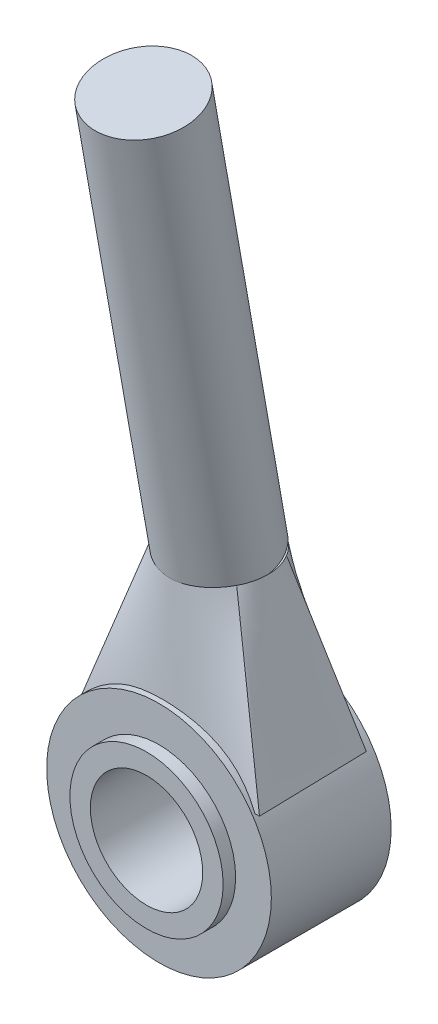
ISO-10303-21;
HEADER;
FILE_DESCRIPTION(('STEP AP214'),'2;1');
FILE_NAME('part.step','',(''),(''),'','','');
FILE_SCHEMA(('AUTOMOTIVE_DESIGN { 1 0 10303 214 1 1 1 1 }'));
ENDSEC;
DATA;
#1=APPLICATION_CONTEXT('core data for automotive mechanical design processes');
#2=APPLICATION_PROTOCOL_DEFINITION('international standard','automotive_design',2000,#1);
#3=PRODUCT_CONTEXT('',#1,'mechanical');
#4=PRODUCT('Part','Part','',(#3));
#5=PRODUCT_RELATED_PRODUCT_CATEGORY('part','',(#4));
#6=PRODUCT_DEFINITION_FORMATION('','',#4);
#7=PRODUCT_DEFINITION_CONTEXT('part definition',#1,'design');
#8=PRODUCT_DEFINITION('design','',#6,#7);
#9=PRODUCT_DEFINITION_SHAPE('','',#8);
#10=(LENGTH_UNIT() NAMED_UNIT(*) SI_UNIT(.MILLI.,.METRE.));
#11=(NAMED_UNIT(*) PLANE_ANGLE_UNIT() SI_UNIT($,.RADIAN.));
#12=(NAMED_UNIT(*) SI_UNIT($,.STERADIAN.) SOLID_ANGLE_UNIT());
#13=UNCERTAINTY_MEASURE_WITH_UNIT(LENGTH_MEASURE(1.E-05),#10,'distance_accuracy_value','');
#14=(GEOMETRIC_REPRESENTATION_CONTEXT(3) GLOBAL_UNCERTAINTY_ASSIGNED_CONTEXT((#13)) GLOBAL_UNIT_ASSIGNED_CONTEXT((#10,
#11,#12)) REPRESENTATION_CONTEXT('',''));
#15=CARTESIAN_POINT('',(0.,0.,0.));
#16=DIRECTION('',(0.,0.,1.));
#17=DIRECTION('',(1.,0.,0.));
#18=AXIS2_PLACEMENT_3D('',#15,#16,#17);
#19=CARTESIAN_POINT('',(-13.8705400464687,10.,1.27208405467628));
#20=CARTESIAN_POINT('',(-6.74020300797196,35.,5.51659180685527));
#21=CARTESIAN_POINT('',(-13.8705400464687,10.,2.7332602371845));
#22=CARTESIAN_POINT('',(-7.0839856706328,35.,6.09243536011873));
#23=CARTESIAN_POINT('',(-13.8705400464687,10.,4.19443641969272));
#24=CARTESIAN_POINT('',(-7.36534175506872,35.,6.73415605144016));
#25=CARTESIAN_POINT('',(-13.8705400464687,10.,7.11678878470916));
#26=CARTESIAN_POINT('',(-7.74869441974719,35.,8.09770033490436));
#27=CARTESIAN_POINT('',(-13.8705400464687,10.,8.57796496721738));
#28=CARTESIAN_POINT('',(-7.85,35.,8.81886912074885));
#29=CARTESIAN_POINT('',(-13.8705400464687,10.,11.5003173322338));
#30=CARTESIAN_POINT('',(-7.85,35.,10.2622119603318));
#31=CARTESIAN_POINT('',(-13.8705400464687,10.,12.961493514742));
#32=CARTESIAN_POINT('',(-7.74869441974719,35.,10.9833807461763));
#33=CARTESIAN_POINT('',(-13.8705400464687,10.,15.8838458797585));
#34=CARTESIAN_POINT('',(-7.36534175506873,35.,12.3469250296405));
#35=CARTESIAN_POINT('',(-13.8705400464687,10.,17.3450220622667));
#36=CARTESIAN_POINT('',(-7.0839856706328,35.,12.988645720962));
#37=CARTESIAN_POINT('',(-13.8705400464687,10.,18.8061982447749));
#38=CARTESIAN_POINT('',(-6.74020300797196,35.,13.5644892742254));
#39=B_SPLINE_SURFACE_WITH_KNOTS('',3,1,((#19,#20),(#21,#22),(#23,#24),(#25,#26),(#27,#28),(#29,
#30),(#31,#32),(#33,#34),(#35,#36),(#37,#38)),.UNSPECIFIED.,.F.,.F.,.F.,(4,2,2,2,4),(2,2),(0.,
0.25,0.5,0.75,1.),(0.,1.),.UNSPECIFIED.);
#40=DIRECTION('',(0.268865100727587,0.942680196167384,-0.197650209624397));
#41=VECTOR('',#40,1.);
#42=CARTESIAN_POINT('',(-10.3053715272203,22.5,16.1853437595002));
#43=LINE('',#42,#41);
#44=CARTESIAN_POINT('',(-13.246779869827,12.1869940133056,18.3476547992516));
#45=VERTEX_POINT('',#44);
#46=CARTESIAN_POINT('',(-6.76046257311622,34.92896701434,13.579382643751));
#47=VERTEX_POINT('',#46);
#48=EDGE_CURVE('E390',#45,#47,#43,.T.);
#49=CARTESIAN_POINT('',(-6.76046257311622,34.92896701434,13.579382643751));
#50=CARTESIAN_POINT('',(-6.80367990061845,34.9306310984566,13.5053174995726));
#51=CARTESIAN_POINT('',(-6.84569552362692,34.9322815557743,13.4305576167863));
#52=CARTESIAN_POINT('',(-6.92729120516826,34.9356001745577,13.2797209263598));
#53=CARTESIAN_POINT('',(-6.96687126994036,34.9372683359781,13.2036441220939));
#54=CARTESIAN_POINT('',(-7.08189615232478,34.942366201838,12.9735747118724));
#55=CARTESIAN_POINT('',(-7.15364153251869,34.9458898652484,12.8177158898537));
#56=CARTESIAN_POINT('',(-7.28585793065852,34.9532135993195,12.5043318670877));
#57=CARTESIAN_POINT('',(-7.34649588358408,34.9570081304978,12.3468769315963));
#58=CARTESIAN_POINT('',(-7.42988846056762,34.9627247314189,12.1080757771135));
#59=CARTESIAN_POINT('',(-7.45642679822129,34.9646345289536,12.0280334373986));
#60=CARTESIAN_POINT('',(-7.50695815302728,34.9683927346866,11.8671448077431));
#61=CARTESIAN_POINT('',(-7.53095115374786,34.9702411424884,11.7862985126161));
#62=CARTESIAN_POINT('',(-7.57802273745289,34.9738757005789,11.617951255703));
#63=CARTESIAN_POINT('',(-7.60090662832708,34.9756474498201,11.5303954274888));
#64=CARTESIAN_POINT('',(-7.64369124600435,34.9789804169447,11.3545589069626));
#65=CARTESIAN_POINT('',(-7.66359194429664,34.980541632816,11.2662782077314));
#66=CARTESIAN_POINT('',(-7.71879725932695,34.9850317376967,11.0004822099984));
#67=CARTESIAN_POINT('',(-7.74960900066405,34.9877673647923,10.8219990365669));
#68=CARTESIAN_POINT('',(-7.78696034633785,34.9915479042457,10.5514433442014));
#69=CARTESIAN_POINT('',(-7.79799010158303,34.9927635591613,10.4599623371185));
#70=CARTESIAN_POINT('',(-7.81690278505968,34.9950146583464,10.2766675273601));
#71=CARTESIAN_POINT('',(-7.82478570683882,34.9960501022464,10.1848537240026));
#72=CARTESIAN_POINT('',(-7.83739632516805,34.9978439430245,10.0010123150058));
#73=CARTESIAN_POINT('',(-7.84212416114595,34.9986023521444,9.90898471899467));
#74=CARTESIAN_POINT('',(-7.84842663659672,34.9996755525864,9.72481875129333));
#75=CARTESIAN_POINT('',(-7.85000126284235,34.9999903420476,9.63268037914005));
#76=CARTESIAN_POINT('',(-7.85,35.,9.54054054054012));
#77=B_SPLINE_CURVE_WITH_KNOTS('',3,(#49,#50,#51,#52,#53,#54,#55,#56,#57,#58,#59,#60,#61,#62,#63,
#64,#65,#66,#67,#68,#69,#70,#71,#72,#73,#74,#75,#76),.UNSPECIFIED.,.F.,.F.,(4,2,2,2,2,2,2,2,2,2,
2,2,2,4),(0.,0.257281258603003,0.514561858093713,1.02902869193569,1.53498135845825,
1.78799188205945,2.041004038904,2.31249071723223,2.58397999003006,3.12691508221996,
3.40332868328466,3.67974285111049,3.95614480298538,4.23254791432272),.UNSPECIFIED.);
#78=CARTESIAN_POINT('',(-7.84991073893341,35.,9.57823753599121));
#79=VERTEX_POINT('',#78);
#80=EDGE_CURVE('E119',#47,#79,#77,.T.);
#81=CARTESIAN_POINT('',(-6.74020300797196,35.,13.5644892742254));
#82=CARTESIAN_POINT('',(-7.0839856706328,35.,12.988645720962));
#83=CARTESIAN_POINT('',(-7.36534175506873,35.,12.3469250296405));
#84=CARTESIAN_POINT('',(-7.74869441974719,35.,10.9833807461763));
#85=CARTESIAN_POINT('',(-7.85,35.,10.2622119603318));
#86=CARTESIAN_POINT('',(-7.85,35.,8.81886912074885));
#87=CARTESIAN_POINT('',(-7.74869441974719,35.,8.09770033490436));
#88=CARTESIAN_POINT('',(-7.36534175506872,35.,6.73415605144016));
#89=CARTESIAN_POINT('',(-7.0839856706328,35.,6.09243536011873));
#90=CARTESIAN_POINT('',(-6.74020300797196,35.,5.51659180685527));
#91=B_SPLINE_CURVE_WITH_KNOTS('',3,(#81,#82,#83,#84,#85,#86,#87,#88,#89,#90),.UNSPECIFIED.,.F.,
.F.,(4,2,2,2,4),(0.,0.25,0.5,0.75,1.),.UNSPECIFIED.);
#92=CARTESIAN_POINT('',(-7.85,35.,9.54054054054035));
#93=VERTEX_POINT('',#92);
#94=EDGE_CURVE('E183',#79,#93,#91,.T.);
#95=CARTESIAN_POINT('',(0.,35.,9.54054054054035));
#96=DIRECTION('',(0.,1.,0.));
#97=DIRECTION('',(0.,0.,1.));
#98=AXIS2_PLACEMENT_3D('',#95,#96,#97);
#99=CIRCLE('',#98,7.85);
#100=CARTESIAN_POINT('',(-6.74020300797196,35.,5.51659180685527));
#101=VERTEX_POINT('',#100);
#102=EDGE_CURVE('E97',#101,#93,#99,.T.);
#103=DIRECTION('',(-0.270691674593689,-0.949084430133604,-0.161135848846978));
#104=VECTOR('',#103,1.);
#105=CARTESIAN_POINT('',(-10.3053715272203,22.5,3.39433793076577));
#106=LINE('',#105,#104);
#107=CARTESIAN_POINT('',(-13.246779869827,12.1869940133056,1.64339257641407));
#108=VERTEX_POINT('',#107);
#109=EDGE_CURVE('E381',#101,#108,#106,.T.);
#110=CARTESIAN_POINT('',(-13.246779869827,12.1869940133056,18.3476547992516));
#111=CARTESIAN_POINT('',(-13.2699060164804,12.1618471723915,17.6177913229239));
#112=CARTESIAN_POINT('',(-13.2900058665322,12.1398650246041,16.8877213406914));
#113=CARTESIAN_POINT('',(-13.3241170706437,12.1024215895729,15.4272780387758));
#114=CARTESIAN_POINT('',(-13.3381284723978,12.0869602512478,14.6969047215138));
#115=CARTESIAN_POINT('',(-13.3600272609578,12.0627494869134,13.2359516256442));
#116=CARTESIAN_POINT('',(-13.367914636363,12.0540000733993,12.5053718466547));
#117=CARTESIAN_POINT('',(-13.3752695850443,12.0458363772352,11.409437149149));
#118=CARTESIAN_POINT('',(-13.3769752124866,12.0439418858838,11.0441126544063));
#119=CARTESIAN_POINT('',(-13.3788652111911,12.0418423700698,10.3134537069479));
#120=CARTESIAN_POINT('',(-13.3790495786115,12.0416373498739,9.94811925420935));
#121=CARTESIAN_POINT('',(-13.3774299081618,12.0434370928451,8.92093988537307));
#122=CARTESIAN_POINT('',(-13.3738905720119,12.0473704360419,8.25909954271885));
#123=CARTESIAN_POINT('',(-13.3619042598687,12.0606629702632,6.93551360810244));
#124=CARTESIAN_POINT('',(-13.353457243856,12.0700222055328,6.2737680169569));
#125=CARTESIAN_POINT('',(-13.3315398819649,12.0942267667834,4.95042248150654));
#126=CARTESIAN_POINT('',(-13.3180692498606,12.1090724053576,4.28882254765024));
#127=CARTESIAN_POINT('',(-13.2861483655706,12.1440841949889,2.96588960002197));
#128=CARTESIAN_POINT('',(-13.2676981602241,12.1642502960003,2.30455658379793));
#129=CARTESIAN_POINT('',(-13.246779869827,12.1869940133056,1.64339257641407));
#130=B_SPLINE_CURVE_WITH_KNOTS('',3,(#110,#111,#112,#113,#114,#115,#116,#117,#118,#119,#120,
#121,#122,#123,#124,#125,#126,#127,#128,#129),.UNSPECIFIED.,.F.,.F.,(4,2,2,2,2,2,2,2,2,4),(0.,
2.19197676462705,4.3839363578792,6.57590003174947,7.67189441230213,8.76789156070735,
10.753431963806,12.7389885581066,14.7246582989039,16.7103093626434),.UNSPECIFIED.);
#131=EDGE_CURVE('E262',#45,#108,#130,.T.);
#132=ORIENTED_EDGE('',*,*,#48,.T.);
#133=ORIENTED_EDGE('',*,*,#80,.T.);
#134=ORIENTED_EDGE('',*,*,#94,.T.);
#135=ORIENTED_EDGE('',*,*,#102,.F.);
#136=ORIENTED_EDGE('',*,*,#109,.T.);
#137=ORIENTED_EDGE('',*,*,#131,.F.);
#138=EDGE_LOOP('',(#132,#133,#134,#135,#136,#137));
#139=FACE_BOUND('',#138,.T.);
#140=ADVANCED_FACE('F92',(#139),#39,.T.);
#141=CARTESIAN_POINT('',(-13.8705400464687,10.,18.8061982447749));
#142=CARTESIAN_POINT('',(-6.74020300797196,35.,13.5644892742254));
#143=CARTESIAN_POINT('',(-12.6381870331409,10.,18.8061982447749));
#144=CARTESIAN_POINT('',(-6.45175625673588,35.,14.0476439536193));
#145=CARTESIAN_POINT('',(-11.4058340198131,10.,18.8061982447749));
#146=CARTESIAN_POINT('',(-6.09284753525384,35.,14.5302245969364));
#147=CARTESIAN_POINT('',(-8.94112799315749,10.,18.8061982447749));
#148=CARTESIAN_POINT('',(-5.21869677155486,35.,15.4384166054526));
#149=CARTESIAN_POINT('',(-7.70877497982969,10.,18.8061982447749));
#150=CARTESIAN_POINT('',(-4.70292304684318,35.,15.8635361414842));
#151=CARTESIAN_POINT('',(-5.24406895317408,10.,18.8061982447749));
#152=CARTESIAN_POINT('',(-3.52886032330848,35.,16.5864544892529));
#153=CARTESIAN_POINT('',(-4.01171593984628,10.,18.8061982447749));
#154=CARTESIAN_POINT('',(-2.87050405255864,35.,16.8833154530183));
#155=CARTESIAN_POINT('',(-1.54700991319067,10.,18.8061982447749));
#156=CARTESIAN_POINT('',(-1.4663414149619,35.,17.2868932168545));
#157=CARTESIAN_POINT('',(-0.314656899862869,10.,18.8061982447749));
#158=CARTESIAN_POINT('',(-0.721281455519524,35.,17.3927858851096));
#159=CARTESIAN_POINT('',(2.15004912679274,10.,18.8061982447749));
#160=CARTESIAN_POINT('',(0.769354222579618,35.,17.3882215973612));
#161=CARTESIAN_POINT('',(3.38240214012054,10.,18.8061982447749));
#162=CARTESIAN_POINT('',(1.51375173613558,35.,17.2777682489911));
#163=CARTESIAN_POINT('',(5.84710816677614,10.,18.8061982447749));
#164=CARTESIAN_POINT('',(2.91541657790625,35.,16.8655991142543));
#165=CARTESIAN_POINT('',(7.07946118010394,10.,18.8061982447749));
#166=CARTESIAN_POINT('',(3.57194255960558,35.,16.5647120151672));
#167=CARTESIAN_POINT('',(9.54416720675955,10.,18.8061982447749));
#168=CARTESIAN_POINT('',(4.74155619514215,35.,15.8346173912304));
#169=CARTESIAN_POINT('',(10.7765202200874,10.,18.8061982447749));
#170=CARTESIAN_POINT('',(5.2547168629232,35.,15.4063472848009));
#171=CARTESIAN_POINT('',(13.241226246743,10.,18.8061982447749));
#172=CARTESIAN_POINT('',(6.12328956669031,35.,14.4928191022696));
#173=CARTESIAN_POINT('',(14.4735792600708,10.,18.8061982447749));
#174=CARTESIAN_POINT('',(6.47923628710947,35.,14.0080495901476));
#175=CARTESIAN_POINT('',(15.7059322733986,10.,18.8061982447749));
#176=CARTESIAN_POINT('',(6.76471884319459,35.,13.5231375541143));
#177=B_SPLINE_SURFACE_WITH_KNOTS('',3,1,((#141,#142),(#143,#144),(#145,#146),(#147,#148),(#149,
#150),(#151,#152),(#153,#154),(#155,#156),(#157,#158),(#159,#160),(#161,#162),(#163,#164),(#165,
#166),(#167,#168),(#169,#170),(#171,#172),(#173,#174),(#175,#176)),.UNSPECIFIED.,.F.,.F.,.F.,(4,
2,2,2,2,2,2,2,4),(2,2),(0.,0.125,0.25,0.375,0.5,0.625,0.75,0.875,1.),(0.,1.),.UNSPECIFIED.);
#178=DIRECTION('',(-0.330283691235495,0.923486766683638,-0.195153465416465));
#179=VECTOR('',#178,1.);
#180=CARTESIAN_POINT('',(11.2353255582966,22.5,16.1646678994446));
#181=LINE('',#180,#179);
#182=CARTESIAN_POINT('',(15.7059322733986,10.,18.8061982447749));
#183=VERTEX_POINT('',#182);
#184=CARTESIAN_POINT('',(6.78650883357228,34.9390742919074,13.5360125226533));
#185=VERTEX_POINT('',#184);
#186=EDGE_CURVE('E450',#183,#185,#181,.T.);
#187=CARTESIAN_POINT('',(6.78650883357228,34.9390742919074,13.5360125226533));
#188=CARTESIAN_POINT('',(6.67786067896092,34.9318015143156,13.7245501781588));
#189=CARTESIAN_POINT('',(6.56135440614228,34.9237645287898,13.9085357403155));
#190=CARTESIAN_POINT('',(6.31345103795717,34.9061136057745,14.266108895303));
#191=CARTESIAN_POINT('',(6.18205367583109,34.8964996400334,14.4396963017757));
#192=CARTESIAN_POINT('',(5.90534333907076,34.8756574627613,14.7749957900743));
#193=CARTESIAN_POINT('',(5.76004517135135,34.8644309626217,14.9367201906946));
#194=CARTESIAN_POINT('',(5.45639040794035,34.8400860366192,15.247245070275));
#195=CARTESIAN_POINT('',(5.29803421955507,34.826967669758,15.3960459520488));
#196=CARTESIAN_POINT('',(4.96923600484533,34.7995274629398,15.6798269007247));
#197=CARTESIAN_POINT('',(4.79878280345093,34.7852045078789,15.814793899233));
#198=CARTESIAN_POINT('',(4.44708438889643,34.7554553191584,16.0697700639144));
#199=CARTESIAN_POINT('',(4.26583911007705,34.7400290787863,16.1897791390694));
#200=CARTESIAN_POINT('',(3.98692905451665,34.7158270682937,16.3578069668723));
#201=CARTESIAN_POINT('',(3.8927829008762,34.7075824033911,16.4118198143745));
#202=CARTESIAN_POINT('',(3.70229855906181,34.6910025406643,16.5158104589512));
#203=CARTESIAN_POINT('',(3.60596035644624,34.682667342244,16.565788229432));
#204=CARTESIAN_POINT('',(3.3139004188708,34.6578055414095,16.7095763829777));
#205=CARTESIAN_POINT('',(3.11509242454317,34.6414190134198,16.797266232048));
#206=CARTESIAN_POINT('',(2.81214505367062,34.6177372422484,16.9160241376866));
#207=CARTESIAN_POINT('',(2.71047148035561,34.6099998639526,16.9534513327791));
#208=CARTESIAN_POINT('',(2.50562389148188,34.5948282710279,17.0240448253066));
#209=CARTESIAN_POINT('',(2.40244988312697,34.5873940549443,17.0572111431911));
#210=CARTESIAN_POINT('',(2.19479161799988,34.5727210400304,17.1191984258314));
#211=CARTESIAN_POINT('',(2.09030736801509,34.5654822401884,17.148019413087));
#212=CARTESIAN_POINT('',(1.88021516571678,34.5514414230561,17.2013090612724));
#213=CARTESIAN_POINT('',(1.77460720699114,34.5446394082597,17.2257776973526));
#214=CARTESIAN_POINT('',(1.45630682557737,34.5254430868377,17.2926936962229));
#215=CARTESIAN_POINT('',(1.24212036438048,34.5142571541544,17.3286563625254));
#216=CARTESIAN_POINT('',(0.919135952424668,34.5009481611885,17.3695841437788));
#217=CARTESIAN_POINT('',(0.811178011362964,34.4970899069639,17.3810579311156));
#218=CARTESIAN_POINT('',(0.594842536273092,34.4905251669147,17.3996518453885));
#219=CARTESIAN_POINT('',(0.486464999866539,34.4878186876284,17.4067719476102));
#220=CARTESIAN_POINT('',(0.267843959794525,34.4834384516897,17.4167012939));
#221=CARTESIAN_POINT('',(0.157597117239,34.4817810054375,17.4194434177939));
#222=CARTESIAN_POINT('',(-0.0629262922345398,34.4793377733385,17.4203628429467));
#223=CARTESIAN_POINT('',(-0.173202859263555,34.4785519907932,17.4185401269163));
#224=CARTESIAN_POINT('',(-0.393590897986769,34.4781395169423,17.410383050481));
#225=CARTESIAN_POINT('',(-0.503702370288255,34.4785128213625,17.4040487067128));
#226=CARTESIAN_POINT('',(-0.723563847704042,34.4805976105923,17.3869110620155));
#227=CARTESIAN_POINT('',(-0.833313855027725,34.4823090872073,17.3761077884531));
#228=CARTESIAN_POINT('',(-1.05225900246474,34.48712220938,17.3500608518062));
#229=CARTESIAN_POINT('',(-1.16145412261622,34.4902239045972,17.3348170301094));
#230=CARTESIAN_POINT('',(-1.3790892155221,34.4977365148012,17.2999035585966));
#231=CARTESIAN_POINT('',(-1.48752918616587,34.5021474334458,17.2802338964156));
#232=CARTESIAN_POINT('',(-1.70346254373363,34.5120866188553,17.236471384487));
#233=CARTESIAN_POINT('',(-1.81095591908934,34.5176148992556,17.2123784807618));
#234=CARTESIAN_POINT('',(-2.02480666629217,34.5294211231223,17.159749166095));
#235=CARTESIAN_POINT('',(-2.13116404156319,34.5356990643284,17.1312127685503));
#236=CARTESIAN_POINT('',(-2.34240498835196,34.5487507699211,17.0697484339662));
#237=CARTESIAN_POINT('',(-2.44729048786832,34.5555237957166,17.036826980779));
#238=CARTESIAN_POINT('',(-2.65554712912405,34.5696888059616,16.9666475724356));
#239=CARTESIAN_POINT('',(-2.75891826920584,34.5770807910885,16.9293896125332));
#240=CARTESIAN_POINT('',(-3.06650777064205,34.6001494106013,16.8111899404288));
#241=CARTESIAN_POINT('',(-3.26824740578873,34.6167214826297,16.7238092789586));
#242=CARTESIAN_POINT('',(-3.56466232109138,34.6425624223592,16.5802646361552));
#243=CARTESIAN_POINT('',(-3.66245680875956,34.6513420222331,16.5303244636832));
#244=CARTESIAN_POINT('',(-3.8558271483719,34.6689791918099,16.4263265716884));
#245=CARTESIAN_POINT('',(-3.95140301474086,34.6778367610053,16.3722688789462));
#246=CARTESIAN_POINT('',(-4.23451414899348,34.7040477782243,16.2039941591989));
#247=CARTESIAN_POINT('',(-4.41848792865396,34.7210446455963,16.0836489137928));
#248=CARTESIAN_POINT('',(-4.77494126513486,34.7542055525628,15.8280129545125));
#249=CARTESIAN_POINT('',(-4.94745355465418,34.7703719310421,15.6927680181319));
#250=CARTESIAN_POINT('',(-5.28040289585111,34.8015730455372,15.4079667509035));
#251=CARTESIAN_POINT('',(-5.44083817136842,34.8166076150985,15.2584083222955));
#252=CARTESIAN_POINT('',(-5.74818516017853,34.8445831670194,14.9462668368614));
#253=CARTESIAN_POINT('',(-5.89511681861504,34.8575272591958,14.7837036749514));
#254=CARTESIAN_POINT('',(-6.17466901138783,34.8815898398485,14.4466983222187));
#255=CARTESIAN_POINT('',(-6.30729737973543,34.8927093294309,14.2722627202922));
#256=CARTESIAN_POINT('',(-6.49037425947931,34.9076658161466,14.0091592717426));
#257=CARTESIAN_POINT('',(-6.54677697245274,34.9122123707594,13.9246187016685));
#258=CARTESIAN_POINT('',(-6.65616794125119,34.920896779388,13.7535156266841));
#259=CARTESIAN_POINT('',(-6.70916120755656,34.9250352381362,13.6669563559047));
#260=CARTESIAN_POINT('',(-6.76046257311621,34.92896701434,13.579382643751));
#261=B_SPLINE_CURVE_WITH_KNOTS('',3,(#187,#188,#189,#190,#191,#192,#193,#194,#195,#196,#197,
#198,#199,#200,#201,#202,#203,#204,#205,#206,#207,#208,#209,#210,#211,#212,#213,#214,#215,#216,
#217,#218,#219,#220,#221,#222,#223,#224,#225,#226,#227,#228,#229,#230,#231,#232,#233,#234,#235,
#236,#237,#238,#239,#240,#241,#242,#243,#244,#245,#246,#247,#248,#249,#250,#251,#252,#253,#254,
#255,#256,#257,#258,#259,#260),.UNSPECIFIED.,.F.,.F.,(4,2,2,2,2,2,2,2,2,2,2,2,2,2,2,2,2,2,2,2,2,
2,2,2,2,2,2,2,2,2,2,2,2,2,2,2,4),(0.,0.65299121839578,1.30599413635422,1.95830907046061,
2.61060366522426,3.26350888855566,3.91641808458517,4.24288903246733,4.56936213182418,
5.22216503464671,5.54795255864422,5.87373851900761,6.19952279241747,6.52530892582331,
7.1768263285913,7.50265900460824,7.8284935302483,8.15927714940643,8.49006202140823,
8.82084567364716,9.15162730027102,9.48242074357125,9.81321511106821,10.1440135155839,
10.4748109227849,10.805124524814,11.1354384883721,11.7959253893491,12.1263219680288,
12.4567163979683,13.1173220412313,13.7759518560631,14.4346783467644,15.0924156981851,
15.7497909528669,16.0549160770563,16.3595820372188),.UNSPECIFIED.);
#262=EDGE_CURVE('E112',#185,#47,#261,.T.);
#263=CARTESIAN_POINT('',(14.9666295470958,10.,18.8061982447749));
#264=CARTESIAN_POINT('',(14.8133144860924,10.2294679410257,18.7603700914276));
#265=CARTESIAN_POINT('',(14.654572567295,10.455620100046,18.7160378214415));
#266=CARTESIAN_POINT('',(14.3264172458381,10.9009299358218,18.6308629979439));
#267=CARTESIAN_POINT('',(14.1569977119137,11.1200834830178,18.5900224817623));
#268=CARTESIAN_POINT('',(13.8078006431749,11.5508241514115,18.5123729756132));
#269=CARTESIAN_POINT('',(13.6280203265018,11.7624092155323,18.4755650761674));
#270=CARTESIAN_POINT('',(13.2584599049455,12.1774567148322,18.4064673280716));
#271=CARTESIAN_POINT('',(13.0686791401777,12.3809186124391,18.3741777780822));
#272=CARTESIAN_POINT('',(12.6809528348143,12.7777072932433,18.3147533725788));
#273=CARTESIAN_POINT('',(12.483078617705,12.9710982662264,18.2875819226441));
#274=CARTESIAN_POINT('',(12.0783172777795,13.3488149492244,18.2384136345467));
#275=CARTESIAN_POINT('',(11.8714320066549,13.533142505272,18.2164157391548));
#276=CARTESIAN_POINT('',(11.4491220705738,13.8922427707054,18.177782690415));
#277=CARTESIAN_POINT('',(11.2336992587357,14.0670175341926,18.1611463803883));
#278=CARTESIAN_POINT('',(10.794830840002,14.4065467261875,18.1332757024736));
#279=CARTESIAN_POINT('',(10.5713867792461,14.5713030694817,18.1220402994762));
#280=CARTESIAN_POINT('',(10.0818703586948,14.915046403632,18.1035005132208));
#281=CARTESIAN_POINT('',(9.81454493289688,15.0923001701038,18.0970714795718));
#282=CARTESIAN_POINT('',(9.27075467077879,15.4323020228525,18.0907057835227));
#283=CARTESIAN_POINT('',(8.99428969549566,15.5950498884341,18.0907692198831));
#284=CARTESIAN_POINT('',(8.43311295852987,15.9055157689389,18.0965247696403));
#285=CARTESIAN_POINT('',(8.1484013163115,16.0532340014473,18.1022168015386));
#286=CARTESIAN_POINT('',(7.57133010658622,16.3333379704647,18.1180755446455));
#287=CARTESIAN_POINT('',(7.27896358347916,16.4657091241271,18.1282464683976));
#288=CARTESIAN_POINT('',(6.68768355401883,16.7145978023708,18.1516229695036));
#289=CARTESIAN_POINT('',(6.38877006964876,16.8311153801752,18.1648285366692));
#290=CARTESIAN_POINT('',(5.78519582220216,17.0480014097374,18.1927462436699));
#291=CARTESIAN_POINT('',(5.48053476525702,17.1483690332477,18.20745846071));
#292=CARTESIAN_POINT('',(4.86013270240625,17.3345345201584,18.2370997164898));
#293=CARTESIAN_POINT('',(4.54429198087743,17.4200005247627,18.2520272004424));
#294=CARTESIAN_POINT('',(3.90835257108015,17.5736103217674,18.2800975835889));
#295=CARTESIAN_POINT('',(3.58825397679136,17.6417544958294,18.2932405220997));
#296=CARTESIAN_POINT('',(2.94470645791877,17.7605113632734,18.3163231058537));
#297=CARTESIAN_POINT('',(2.62125757373276,17.8111242677945,18.3262627896754));
#298=CARTESIAN_POINT('',(1.97228209314377,17.8946090733677,18.3419146545634));
#299=CARTESIAN_POINT('',(1.646757741943,17.9274976479708,18.3476308106526));
#300=CARTESIAN_POINT('',(0.994344653105458,17.9754907811135,18.354033255977));
#301=CARTESIAN_POINT('',(0.667455891472291,17.9905950255395,18.3547194563722));
#302=CARTESIAN_POINT('',(0.0133774699039383,18.0029664255722,18.3507076551307));
#303=CARTESIAN_POINT('',(-0.313812177795874,18.0002342769739,18.3460098635285));
#304=CARTESIAN_POINT('',(-0.887857926564736,17.9797923401344,18.3333510705578));
#305=CARTESIAN_POINT('',(-1.13488160112197,17.9658903294,18.3264627701223));
#306=CARTESIAN_POINT('',(-1.62805839839404,17.9279275583545,18.3100780659272));
#307=CARTESIAN_POINT('',(-1.87421154029521,17.9038670233594,18.3005817200157));
#308=CARTESIAN_POINT('',(-2.36524264245413,17.8456368645595,18.2793277981125));
#309=CARTESIAN_POINT('',(-2.61012049622033,17.8114664098855,18.2675700362974));
#310=CARTESIAN_POINT('',(-3.09815469951661,17.7330914617373,18.2423308792137));
#311=CARTESIAN_POINT('',(-3.34131108140199,17.6888871573697,18.2288495164317));
#312=CARTESIAN_POINT('',(-4.0682662795861,17.5412052460266,18.186801061726));
#313=CARTESIAN_POINT('',(-4.54900925759931,17.4227229808681,18.1566558096567));
#314=CARTESIAN_POINT('',(-5.49918107578865,17.1465389583707,18.0980632804048));
#315=CARTESIAN_POINT('',(-5.96861002213586,16.9888375692221,18.0696159872849));
#316=CARTESIAN_POINT('',(-6.74513246235878,16.6918072142086,18.028536357742));
#317=CARTESIAN_POINT('',(-7.05607933381466,16.562762303532,18.0137566618819));
#318=CARTESIAN_POINT('',(-7.67045288585303,16.2873404174976,17.9896716420783));
#319=CARTESIAN_POINT('',(-7.97387942428233,16.1409631148157,17.9803664215407));
#320=CARTESIAN_POINT('',(-8.57217527206216,15.8313385537687,17.9687182304545));
#321=CARTESIAN_POINT('',(-8.86704385246975,15.668089863716,17.9663758512679));
#322=CARTESIAN_POINT('',(-9.4465337265308,15.3256655842633,17.9697577187621));
#323=CARTESIAN_POINT('',(-9.73117472662221,15.1465232185058,17.9754654933494));
#324=CARTESIAN_POINT('',(-10.2897440941228,14.7727483229684,17.9955463248839));
#325=CARTESIAN_POINT('',(-10.5636733164628,14.5781170331726,18.0099186887817));
#326=CARTESIAN_POINT('',(-11.0996961014139,14.1742467917575,18.0475180578085));
#327=CARTESIAN_POINT('',(-11.3617961267707,13.9650159794891,18.0707401608521));
#328=CARTESIAN_POINT('',(-11.7618193429879,13.6270061445882,18.1138292585906));
#329=CARTESIAN_POINT('',(-11.9040631387491,13.5029204942351,18.1307452459335));
#330=CARTESIAN_POINT('',(-12.1843584632493,13.2505455378629,18.1672452397213));
#331=CARTESIAN_POINT('',(-12.3224111025876,13.1222573645228,18.1868285316857));
#332=CARTESIAN_POINT('',(-12.5940805659672,12.8617462332234,18.2285426630256));
#333=CARTESIAN_POINT('',(-12.7277017438437,12.7295273948849,18.2506709003824));
#334=CARTESIAN_POINT('',(-12.9905649177639,12.4611605657487,18.2973665172691));
#335=CARTESIAN_POINT('',(-13.1198058617212,12.325011645325,18.3219344773033));
#336=CARTESIAN_POINT('',(-13.2467798698269,12.1869940133056,18.3476547992516));
#337=B_SPLINE_CURVE_WITH_KNOTS('',3,(#263,#264,#265,#266,#267,#268,#269,#270,#271,#272,#273,
#274,#275,#276,#277,#278,#279,#280,#281,#282,#283,#284,#285,#286,#287,#288,#289,#290,#291,#292,
#293,#294,#295,#296,#297,#298,#299,#300,#301,#302,#303,#304,#305,#306,#307,#308,#309,#310,#311,
#312,#313,#314,#315,#316,#317,#318,#319,#320,#321,#322,#323,#324,#325,#326,#327,#328,#329,#330,
#331,#332,#333,#334,#335,#336),.UNSPECIFIED.,.F.,.F.,(4,2,2,2,2,2,2,2,2,2,2,2,2,2,2,2,2,2,2,2,2,
2,2,2,2,2,2,2,2,2,2,2,2,2,2,2,4),(0.,0.839194348320639,1.6788750456755,2.51878225637413,
3.35874495834272,4.19245279620038,5.02599011537938,5.85934749126076,6.69254508649204,
7.65445090757267,8.61637136075703,9.57827788616378,10.5410910546886,11.5039009908034,
12.4667602887301,13.4488931712401,14.4310044119892,15.4131038241969,16.3942777404483,
17.3754689863021,18.3566219562571,19.0989407657891,19.8412431115454,20.5836064792979,
21.3259558569902,22.8122885007049,24.2986071912119,25.3090409850778,26.3194938641373,
27.3300325596467,28.33850650466,29.3468997961638,30.3547353241347,30.9231900167339,
31.4914927379673,32.0592194923634,32.6270816560626),.UNSPECIFIED.);
#338=CARTESIAN_POINT('',(14.9666295470958,10.,18.8061982447749));
#339=VERTEX_POINT('',#338);
#340=EDGE_CURVE('E104',#339,#45,#337,.T.);
#341=DIRECTION('',(1.,0.,0.));
#342=VECTOR('',#341,1.);
#343=CARTESIAN_POINT('',(15.7059322733986,10.,18.8061982447749));
#344=LINE('',#343,#342);
#345=EDGE_CURVE('E391',#339,#183,#344,.T.);
#346=ORIENTED_EDGE('',*,*,#186,.T.);
#347=ORIENTED_EDGE('',*,*,#262,.T.);
#348=ORIENTED_EDGE('',*,*,#48,.F.);
#349=ORIENTED_EDGE('',*,*,#340,.F.);
#350=ORIENTED_EDGE('',*,*,#345,.T.);
#351=EDGE_LOOP('',(#346,#347,#348,#349,#350));
#352=FACE_BOUND('',#351,.T.);
#353=ADVANCED_FACE('F215',(#352),#177,.T.);
#354=CARTESIAN_POINT('',(15.7059322733986,10.,18.8061982447749));
#355=CARTESIAN_POINT('',(6.76471884319459,35.,13.5231375541143));
#356=CARTESIAN_POINT('',(15.6715249790071,10.,17.3450220622667));
#357=CARTESIAN_POINT('',(7.10500520658648,35.,12.9451374283989));
#358=CARTESIAN_POINT('',(15.6371176846157,10.,15.8838458797585));
#359=CARTESIAN_POINT('',(7.38245063903609,35.,12.3016266411091));
#360=CARTESIAN_POINT('',(15.5683030958329,10.,12.961493514742));
#361=CARTESIAN_POINT('',(7.75744973328877,35.,10.9355844567152));
#362=CARTESIAN_POINT('',(15.5338958014415,10.,11.5003173322338));
#363=CARTESIAN_POINT('',(7.85431598120922,35.,10.2137124595819));
#364=CARTESIAN_POINT('',(15.4650812126587,10.,8.57796496721735));
#365=CARTESIAN_POINT('',(7.8453834267392,35.,8.77021667831709));
#366=CARTESIAN_POINT('',(15.4306739182672,10.,7.11678878470913));
#367=CARTESIAN_POINT('',(7.73959084880263,35.,8.04959876243864));
#368=CARTESIAN_POINT('',(15.3618593294844,10.,4.1944364196927));
#369=CARTESIAN_POINT('',(7.34771459908349,35.,6.68830211029405));
#370=CARTESIAN_POINT('',(15.327452035093,10.,2.73326023718448));
#371=CARTESIAN_POINT('',(7.06232644914577,35.,6.0482742161983));
#372=CARTESIAN_POINT('',(15.2930447407016,10.,1.27208405467627));
#373=CARTESIAN_POINT('',(6.71491292811593,35.,5.47452967387735));
#374=B_SPLINE_SURFACE_WITH_KNOTS('',3,1,((#354,#355),(#356,#357),(#358,#359),(#360,#361),(#362,
#363),(#364,#365),(#366,#367),(#368,#369),(#370,#371),(#372,#373)),.UNSPECIFIED.,.F.,.F.,.F.,(4,
2,2,2,4),(2,2),(0.,0.25,0.5,0.75,1.),(0.,1.),.UNSPECIFIED.);
#375=CARTESIAN_POINT('',(7.84996031483027,34.9999943470458,9.565321701251));
#376=VERTEX_POINT('',#375);
#377=CARTESIAN_POINT('',(7.84999999996233,34.999995776732,9.54056449188397));
#378=VERTEX_POINT('',#377);
#379=EDGE_CURVE('E161',#376,#378,#99,.T.);
#380=CARTESIAN_POINT('',(7.84999999984897,34.999991544032,9.54058849671843));
#381=CARTESIAN_POINT('',(7.85000171857737,34.999935814963,9.65443320715641));
#382=CARTESIAN_POINT('',(7.84759639152597,34.999544321292,9.76827615587621));
#383=CARTESIAN_POINT('',(7.83797453401867,34.9982910061355,9.99575686586984));
#384=CARTESIAN_POINT('',(7.83075796947666,34.9974291813177,10.1093946256843));
#385=CARTESIAN_POINT('',(7.81151334064651,34.9954360819348,10.3362992226218));
#386=CARTESIAN_POINT('',(7.79948368449471,34.9943047182737,10.4495659245147));
#387=CARTESIAN_POINT('',(7.7706323461886,34.9918528248925,10.6754768858194));
#388=CARTESIAN_POINT('',(7.75381071621924,34.9905322972326,10.7881211519958));
#389=CARTESIAN_POINT('',(7.69701712040621,34.9863840504728,11.1199965150674));
#390=CARTESIAN_POINT('',(7.65029289187867,34.9833229622967,11.3381078303311));
#391=CARTESIAN_POINT('',(7.53882448075738,34.9758642056596,11.7695535983286));
#392=CARTESIAN_POINT('',(7.47408791096362,34.9714671017848,11.9828900280711));
#393=CARTESIAN_POINT('',(7.36014670078248,34.9646336845855,12.308753646962));
#394=CARTESIAN_POINT('',(7.31705752543255,34.9622052271115,12.4234535905437));
#395=CARTESIAN_POINT('',(7.22566278999346,34.9574245046596,12.6507396039012));
#396=CARTESIAN_POINT('',(7.17735825143671,34.9550722248777,12.7633260825879));
#397=CARTESIAN_POINT('',(7.075011168848,34.9504383416281,12.9875041856072));
#398=CARTESIAN_POINT('',(7.02090643891863,34.9481579329511,13.0990674279757));
#399=CARTESIAN_POINT('',(6.9075440976322,34.9436191067421,13.3195735365351));
#400=CARTESIAN_POINT('',(6.84828543832357,34.9413606937867,13.428515864038));
#401=CARTESIAN_POINT('',(6.78650883357227,34.9390742919074,13.5360125226533));
#402=B_SPLINE_CURVE_WITH_KNOTS('',3,(#380,#381,#382,#383,#384,#385,#386,#387,#388,#389,#390,
#391,#392,#393,#394,#395,#396,#397,#398,#399,#400,#401),.UNSPECIFIED.,.F.,.F.,(4,2,2,2,2,2,2,2,
2,2,4),(0.,0.341505514206709,0.683013447898088,1.02463442411875,1.36625168020363,
2.03466573583235,2.70279771856256,3.07033789900202,3.43780621955515,3.80970710305191,
4.18168378296093),.UNSPECIFIED.);
#403=EDGE_CURVE('E13',#376,#185,#402,.T.);
#404=DIRECTION('',(-0.023541144093845,0.,-0.999722868866544));
#405=VECTOR('',#404,1.);
#406=CARTESIAN_POINT('',(15.2930447407016,10.,1.27208405467627));
#407=LINE('',#406,#405);
#408=CARTESIAN_POINT('',(15.2930447407016,10.,1.27208405467627));
#409=VERTEX_POINT('',#408);
#410=EDGE_CURVE('E409',#183,#409,#407,.T.);
#411=DIRECTION('',(-0.320525027202271,0.934134127934485,0.15702591494738));
#412=VECTOR('',#411,1.);
#413=CARTESIAN_POINT('',(11.0039788344088,22.5,3.37330686427681));
#414=LINE('',#413,#412);
#415=CARTESIAN_POINT('',(6.71491292811593,35.,5.47452967387735));
#416=VERTEX_POINT('',#415);
#417=EDGE_CURVE('E165',#409,#416,#414,.T.);
#418=EDGE_CURVE('E156',#378,#416,#99,.T.);
#419=ORIENTED_EDGE('',*,*,#379,.F.);
#420=ORIENTED_EDGE('',*,*,#403,.T.);
#421=ORIENTED_EDGE('',*,*,#186,.F.);
#422=ORIENTED_EDGE('',*,*,#410,.T.);
#423=ORIENTED_EDGE('',*,*,#417,.T.);
#424=ORIENTED_EDGE('',*,*,#418,.F.);
#425=EDGE_LOOP('',(#419,#420,#421,#422,#423,#424));
#426=FACE_BOUND('',#425,.T.);
#427=ADVANCED_FACE('F159',(#426),#374,.T.);
#428=CARTESIAN_POINT('',(0.,0.,19.2));
#429=DIRECTION('',(0.,0.,-1.));
#430=DIRECTION('',(-1.,0.,0.));
#431=AXIS2_PLACEMENT_3D('',#428,#429,#430);
#432=CYLINDRICAL_SURFACE('',#431,18.);
#433=DIRECTION('',(0.,0.,-1.));
#434=VECTOR('',#433,1.);
#435=CARTESIAN_POINT('',(14.9666295470958,10.,19.2));
#436=LINE('',#435,#434);
#437=CARTESIAN_POINT('',(14.9666295470958,10.,1.27208405467627));
#438=VERTEX_POINT('',#437);
#439=EDGE_CURVE('E442',#438,#339,#436,.F.);
#440=ORIENTED_EDGE('',*,*,#439,.T.);
#441=ORIENTED_EDGE('',*,*,#340,.T.);
#442=ORIENTED_EDGE('',*,*,#131,.T.);
#443=CARTESIAN_POINT('',(-13.246779869827,12.1869940133056,1.64339257641406));
#444=CARTESIAN_POINT('',(-13.0647988184607,12.384809638748,1.67232977740749));
#445=CARTESIAN_POINT('',(-12.8782080477944,12.578724812337,1.69901194927051));
#446=CARTESIAN_POINT('',(-12.4962349604396,12.9582609542644,1.74754247963683));
#447=CARTESIAN_POINT('',(-12.3008540788877,13.1438832667628,1.76939162379329));
#448=CARTESIAN_POINT('',(-11.9016978832704,13.5063789930432,1.80793919603564));
#449=CARTESIAN_POINT('',(-11.6979237798099,13.6832536605078,1.82463836400508));
#450=CARTESIAN_POINT('',(-11.2824219556192,14.0278219209452,1.8527049429852));
#451=CARTESIAN_POINT('',(-11.0706947219725,14.1955160746308,1.86407267994214));
#452=CARTESIAN_POINT('',(-10.6412801458711,14.5201617150433,1.88136512743625));
#453=CARTESIAN_POINT('',(-10.4236450938603,14.6771803667288,1.8873274975575));
#454=CARTESIAN_POINT('',(-9.98152791668396,14.9813582757912,1.89405362428675));
#455=CARTESIAN_POINT('',(-9.75704608213388,15.1285179507924,1.89481760123574));
#456=CARTESIAN_POINT('',(-9.30176776748708,15.4126283054593,1.89141958034778));
#457=CARTESIAN_POINT('',(-9.07097164171428,15.5495795563669,1.88725785836285));
#458=CARTESIAN_POINT('',(-8.60362282573701,15.812957177946,1.87447912224927));
#459=CARTESIAN_POINT('',(-8.36707098539627,15.9393850904062,1.86586276211434));
#460=CARTESIAN_POINT('',(-7.84947371816993,16.2013306261685,1.84308146293367));
#461=CARTESIAN_POINT('',(-7.56749104551017,16.3349410972196,1.82823851627738));
#462=CARTESIAN_POINT('',(-6.99719018117584,16.5872407983387,1.79462518590405));
#463=CARTESIAN_POINT('',(-6.70887239126166,16.7059309714319,1.77585505060173));
#464=CARTESIAN_POINT('',(-6.12661608622357,16.9281326478269,1.73584435469985));
#465=CARTESIAN_POINT('',(-5.83267755159114,17.0316440984355,1.71460378552457));
#466=CARTESIAN_POINT('',(-5.23969859228173,17.2233188495677,1.67123990154473));
#467=CARTESIAN_POINT('',(-4.94065506604662,17.3114724264833,1.64911603831143));
#468=CARTESIAN_POINT('',(-4.33835032498496,17.4721452541615,1.60554069153363));
#469=CARTESIAN_POINT('',(-4.0350891579785,17.5446646820323,1.58408920037467));
#470=CARTESIAN_POINT('',(-3.42504883830646,17.673886410781,1.54334538005672));
#471=CARTESIAN_POINT('',(-3.11826944212911,17.7305876098481,1.5240532013596));
#472=CARTESIAN_POINT('',(-2.4776845498145,17.8318349932239,1.48766228317152));
#473=CARTESIAN_POINT('',(-2.14365414416504,17.8750714588194,1.47085613586102));
#474=CARTESIAN_POINT('',(-1.47344933552686,17.9427531878216,1.44259158134735));
#475=CARTESIAN_POINT('',(-1.13727481730665,17.9671974325459,1.4311334640616));
#476=CARTESIAN_POINT('',(-0.463941093052427,17.9971753217358,1.41431588445313));
#477=CARTESIAN_POINT('',(-0.126781929941297,18.0027097785605,1.40895616015176));
#478=CARTESIAN_POINT('',(0.547344173006449,17.9948335737295,1.40479159447674));
#479=CARTESIAN_POINT('',(0.884311119466387,17.9814236099369,1.40598651165184));
#480=CARTESIAN_POINT('',(1.55688942712581,17.9357107397312,1.41456256790106));
#481=CARTESIAN_POINT('',(1.89250072973529,17.9034070253568,1.42194397153628));
#482=CARTESIAN_POINT('',(2.5612169472674,17.820036241692,1.44202066714839));
#483=CARTESIAN_POINT('',(2.8943219494969,17.7689698291165,1.45471577314207));
#484=CARTESIAN_POINT('',(3.46386370634955,17.6652285536553,1.48013535872913));
#485=CARTESIAN_POINT('',(3.70117227366203,17.6170344584087,1.49184998437807));
#486=CARTESIAN_POINT('',(4.17357780791925,17.5111353082381,1.51686287732462));
#487=CARTESIAN_POINT('',(4.40867464219422,17.4534296865666,1.53016123897656));
#488=CARTESIAN_POINT('',(5.11007875077462,17.2661868135761,1.57140297330721));
#489=CARTESIAN_POINT('',(5.57261499083814,17.1225025213509,1.60069876423278));
#490=CARTESIAN_POINT('',(6.4846582233043,16.7983194415894,1.65736469930046));
#491=CARTESIAN_POINT('',(6.93416508437626,16.6178202831218,1.68473482403662));
#492=CARTESIAN_POINT('',(7.8175504552332,16.2209812882847,1.73212966693236));
#493=CARTESIAN_POINT('',(8.25142943080453,16.0046425211862,1.75215460417757));
#494=CARTESIAN_POINT('',(8.97147279704984,15.6085392708699,1.77616117124513));
#495=CARTESIAN_POINT('',(9.26245307275081,15.4376428152866,1.78316907482923));
#496=CARTESIAN_POINT('',(9.83445409486006,15.0796987567883,1.79048822148747));
#497=CARTESIAN_POINT('',(10.1154740167368,14.8926498211332,1.79079891144381));
#498=CARTESIAN_POINT('',(10.6665151642699,14.5030798973624,1.7840797638328));
#499=CARTESIAN_POINT('',(10.9365355407751,14.300557718189,1.77704936065382));
#500=CARTESIAN_POINT('',(11.4644339451818,13.8809356086928,1.7554412494574));
#501=CARTESIAN_POINT('',(11.7223188713566,13.6638441346688,1.74086788710341));
#502=CARTESIAN_POINT('',(12.2251860871081,13.2158323191768,1.70433210148163));
#503=CARTESIAN_POINT('',(12.4701693803574,12.9849130564265,1.68237025398027));
#504=CARTESIAN_POINT('',(12.9463520239401,12.510193135545,1.63151008100779));
#505=CARTESIAN_POINT('',(13.177557580505,12.2663983720209,1.60261490861728));
#506=CARTESIAN_POINT('',(13.544206024363,11.8574938661775,1.55018903801514));
#507=CARTESIAN_POINT('',(13.6839338920231,11.6959612477604,1.52852093656197));
#508=CARTESIAN_POINT('',(13.9573665444764,11.36826451826,1.48285313507098));
#509=CARTESIAN_POINT('',(14.0910729691085,11.2021016883362,1.45885407551961));
#510=CARTESIAN_POINT('',(14.3520440559251,10.8657277053625,1.40879889130509));
#511=CARTESIAN_POINT('',(14.4793230480131,10.6955269255246,1.38274770722063));
#512=CARTESIAN_POINT('',(14.7276738335752,10.350882107065,1.32876607945622));
#513=CARTESIAN_POINT('',(14.8487441223522,10.1764370547943,1.30083518397992));
#514=CARTESIAN_POINT('',(14.9666295470958,10.,1.27208405467627));
#515=B_SPLINE_CURVE_WITH_KNOTS('',3,(#443,#444,#445,#446,#447,#448,#449,#450,#451,#452,#453,
#454,#455,#456,#457,#458,#459,#460,#461,#462,#463,#464,#465,#466,#467,#468,#469,#470,#471,#472,
#473,#474,#475,#476,#477,#478,#479,#480,#481,#482,#483,#484,#485,#486,#487,#488,#489,#490,#491,
#492,#493,#494,#495,#496,#497,#498,#499,#500,#501,#502,#503,#504,#505,#506,#507,#508,#509,#510,
#511,#512,#513,#514),.UNSPECIFIED.,.F.,.F.,(4,2,2,2,2,2,2,2,2,2,2,2,2,2,2,2,2,2,2,2,2,2,2,2,2,2,
2,2,2,2,2,2,2,2,2,4),(0.,0.810964679468349,1.62179743211851,2.43251364023246,3.24318027734394,
4.048154539387,4.85309468128344,5.65798974655887,6.46276667723405,7.39946386547077,
8.3361018207333,9.27274302747666,10.2099751163079,11.1471965873429,12.0844833237823,
13.0956202937664,14.1068120712551,15.1179604076823,16.1290714970082,17.1402258280562,
18.1513447709702,18.8784548080878,19.6056081859721,21.0595637694533,22.5135340031059,
23.967460865515,24.9794943191194,25.9916113554762,27.0038063785027,28.0154189019084,
29.0269526110974,30.0380271722583,30.6819254598438,31.3256473188332,31.9678641633135,
32.6102359223726),.UNSPECIFIED.);
#516=EDGE_CURVE('E351',#108,#438,#515,.T.);
#517=ORIENTED_EDGE('',*,*,#516,.T.);
#518=EDGE_LOOP('',(#440,#441,#442,#517));
#519=FACE_BOUND('',#518,.T.);
#520=CARTESIAN_POINT('',(0.,0.,19.2));
#521=DIRECTION('',(0.,0.,1.));
#522=DIRECTION('',(1.,0.,0.));
#523=AXIS2_PLACEMENT_3D('',#520,#521,#522);
#524=CIRCLE('',#523,18.);
#525=CARTESIAN_POINT('',(18.,0.,19.2));
#526=VERTEX_POINT('',#525);
#527=EDGE_CURVE('E345',#526,#526,#524,.T.);
#528=ORIENTED_EDGE('',*,*,#527,.F.);
#529=EDGE_LOOP('',(#528));
#530=FACE_BOUND('',#529,.T.);
#531=CARTESIAN_POINT('',(0.,0.,0.));
#532=DIRECTION('',(0.,0.,1.));
#533=DIRECTION('',(1.,0.,0.));
#534=AXIS2_PLACEMENT_3D('',#531,#532,#533);
#535=CIRCLE('',#534,18.);
#536=CARTESIAN_POINT('',(18.,0.,0.));
#537=VERTEX_POINT('',#536);
#538=EDGE_CURVE('E342',#537,#537,#535,.T.);
#539=ORIENTED_EDGE('',*,*,#538,.T.);
#540=EDGE_LOOP('',(#539));
#541=FACE_BOUND('',#540,.T.);
#542=ADVANCED_FACE('F94',(#519,#530,#541),#432,.T.);
#543=CARTESIAN_POINT('',(0.,0.,19.2));
#544=DIRECTION('',(0.,0.,1.));
#545=DIRECTION('',(1.,0.,0.));
#546=AXIS2_PLACEMENT_3D('',#543,#544,#545);
#547=PLANE('',#546);
#548=CARTESIAN_POINT('',(0.,0.,19.2));
#549=DIRECTION('',(0.,0.,1.));
#550=DIRECTION('',(1.,0.,0.));
#551=AXIS2_PLACEMENT_3D('',#548,#549,#550);
#552=CIRCLE('',#551,12.2764584324514);
#553=CARTESIAN_POINT('',(12.2764584324514,0.,19.2));
#554=VERTEX_POINT('',#553);
#555=EDGE_CURVE('E294',#554,#554,#552,.T.);
#556=ORIENTED_EDGE('',*,*,#555,.F.);
#557=EDGE_LOOP('',(#556));
#558=FACE_BOUND('',#557,.T.);
#559=ORIENTED_EDGE('',*,*,#527,.T.);
#560=EDGE_LOOP('',(#559));
#561=FACE_BOUND('',#560,.T.);
#562=ADVANCED_FACE('F329',(#558,#561),#547,.T.);
#563=CARTESIAN_POINT('',(0.,0.,0.));
#564=DIRECTION('',(0.,0.,1.));
#565=DIRECTION('',(1.,0.,0.));
#566=AXIS2_PLACEMENT_3D('',#563,#564,#565);
#567=PLANE('',#566);
#568=CARTESIAN_POINT('',(0.,0.,0.));
#569=DIRECTION('',(0.,0.,-1.));
#570=DIRECTION('',(-1.,0.,0.));
#571=AXIS2_PLACEMENT_3D('',#568,#569,#570);
#572=CIRCLE('',#571,9.);
#573=CARTESIAN_POINT('',(-9.,0.,0.));
#574=VERTEX_POINT('',#573);
#575=EDGE_CURVE('E182',#574,#574,#572,.T.);
#576=ORIENTED_EDGE('',*,*,#575,.F.);
#577=EDGE_LOOP('',(#576));
#578=FACE_BOUND('',#577,.T.);
#579=ORIENTED_EDGE('',*,*,#538,.F.);
#580=EDGE_LOOP('',(#579));
#581=FACE_BOUND('',#580,.T.);
#582=ADVANCED_FACE('F324',(#578,#581),#567,.F.);
#583=CARTESIAN_POINT('',(0.,0.,21.2));
#584=DIRECTION('',(0.,0.,1.));
#585=DIRECTION('',(1.,0.,0.));
#586=AXIS2_PLACEMENT_3D('',#583,#584,#585);
#587=PLANE('',#586);
#588=CARTESIAN_POINT('',(0.,0.,21.2));
#589=DIRECTION('',(0.,0.,1.));
#590=DIRECTION('',(1.,0.,0.));
#591=AXIS2_PLACEMENT_3D('',#588,#589,#590);
#592=CIRCLE('',#591,9.);
#593=CARTESIAN_POINT('',(9.,0.,21.2));
#594=VERTEX_POINT('',#593);
#595=EDGE_CURVE('E402',#594,#594,#592,.T.);
#596=ORIENTED_EDGE('',*,*,#595,.F.);
#597=EDGE_LOOP('',(#596));
#598=FACE_BOUND('',#597,.T.);
#599=CARTESIAN_POINT('',(0.,0.,21.2));
#600=DIRECTION('',(0.,0.,1.));
#601=DIRECTION('',(1.,0.,0.));
#602=AXIS2_PLACEMENT_3D('',#599,#600,#601);
#603=CIRCLE('',#602,12.2764584324514);
#604=CARTESIAN_POINT('',(12.2764584324514,0.,21.2));
#605=VERTEX_POINT('',#604);
#606=EDGE_CURVE('E346',#605,#605,#603,.T.);
#607=ORIENTED_EDGE('',*,*,#606,.T.);
#608=EDGE_LOOP('',(#607));
#609=FACE_BOUND('',#608,.T.);
#610=ADVANCED_FACE('F318',(#598,#609),#587,.T.);
#611=CARTESIAN_POINT('',(0.,0.,21.2));
#612=DIRECTION('',(0.,0.,-1.));
#613=DIRECTION('',(-1.,0.,0.));
#614=AXIS2_PLACEMENT_3D('',#611,#612,#613);
#615=CYLINDRICAL_SURFACE('',#614,12.2764584324514);
#616=ORIENTED_EDGE('',*,*,#606,.F.);
#617=EDGE_LOOP('',(#616));
#618=FACE_BOUND('',#617,.T.);
#619=ORIENTED_EDGE('',*,*,#555,.T.);
#620=EDGE_LOOP('',(#619));
#621=FACE_BOUND('',#620,.T.);
#622=ADVANCED_FACE('F323',(#618,#621),#615,.T.);
#623=CARTESIAN_POINT('',(0.,10.,0.));
#624=DIRECTION('',(0.,-1.,0.));
#625=DIRECTION('',(0.,0.,-1.));
#626=AXIS2_PLACEMENT_3D('',#623,#624,#625);
#627=PLANE('',#626);
#628=ORIENTED_EDGE('',*,*,#439,.F.);
#629=DIRECTION('',(-1.,0.,0.));
#630=VECTOR('',#629,1.);
#631=CARTESIAN_POINT('',(-13.8705400464687,10.,1.27208405467627));
#632=LINE('',#631,#630);
#633=EDGE_CURVE('E406',#409,#438,#632,.T.);
#634=ORIENTED_EDGE('',*,*,#633,.F.);
#635=ORIENTED_EDGE('',*,*,#410,.F.);
#636=ORIENTED_EDGE('',*,*,#345,.F.);
#637=EDGE_LOOP('',(#628,#634,#635,#636));
#638=FACE_BOUND('',#637,.T.);
#639=ADVANCED_FACE('F251',(#638),#627,.T.);
#640=CARTESIAN_POINT('',(15.2930447407016,10.,1.27208405467627));
#641=CARTESIAN_POINT('',(6.71491292811593,35.,5.47452967387735));
#642=CARTESIAN_POINT('',(14.0778953745695,10.,1.27208405467627));
#643=CARTESIAN_POINT('',(6.42452590619946,35.,4.99496293596938));
#644=CARTESIAN_POINT('',(12.8627460084374,10.,1.27208405467627));
#645=CARTESIAN_POINT('',(6.06433272429144,35.,4.51663194241364));
#646=CARTESIAN_POINT('',(10.4324472761732,10.,1.27208405467627));
#647=CARTESIAN_POINT('',(5.18979758175801,35.,3.61755226994398));
#648=CARTESIAN_POINT('',(9.2172979100411,10.,1.27208405467627));
#649=CARTESIAN_POINT('',(4.67494659417705,35.,3.19728905884269));
#650=CARTESIAN_POINT('',(6.78699917777691,10.,1.27208405467627));
#651=CARTESIAN_POINT('',(3.50530425502614,35.,2.48328844796474));
#652=CARTESIAN_POINT('',(5.57184981164481,10.,1.27208405467627));
#653=CARTESIAN_POINT('',(2.85045781645197,35.,2.19045960210446));
#654=CARTESIAN_POINT('',(3.14155107938062,10.,1.27208405467627));
#655=CARTESIAN_POINT('',(1.45515567992925,35.,1.79255231700126));
#656=CARTESIAN_POINT('',(1.92640171324852,10.,1.27208405467627));
#657=CARTESIAN_POINT('',(0.715425598823956,35.,1.68826568637504));
#658=CARTESIAN_POINT('',(-0.503897019015668,10.,1.27208405467627));
#659=CARTESIAN_POINT('',(-0.764505239916533,35.,1.69289210862461));
#660=CARTESIAN_POINT('',(-1.71904638514776,10.,1.27208405467627));
#661=CARTESIAN_POINT('',(-1.50356884709799,35.,1.80180160664633));
#662=CARTESIAN_POINT('',(-4.14934511741195,10.,1.27208405467627));
#663=CARTESIAN_POINT('',(-2.89635593534251,35.,2.20842475717079));
#664=CARTESIAN_POINT('',(-5.36449448354405,10.,1.27208405467627));
#665=CARTESIAN_POINT('',(-3.54935876425305,35.,2.50534207986511));
#666=CARTESIAN_POINT('',(-7.79479321580824,10.,1.27208405467627));
#667=CARTESIAN_POINT('',(-4.71451420177967,35.,3.2266415185663));
#668=CARTESIAN_POINT('',(-9.00994258194033,10.,1.27208405467627));
#669=CARTESIAN_POINT('',(-5.22672757674143,35.,3.65011544282675));
#670=CARTESIAN_POINT('',(-11.4402413142045,10.,1.27208405467627));
#671=CARTESIAN_POINT('',(-6.09562444287559,35.,4.55464527041472));
#672=CARTESIAN_POINT('',(-12.6553906803366,10.,1.27208405467627));
#673=CARTESIAN_POINT('',(-6.45281998627376,35.,5.03521889793245));
#674=CARTESIAN_POINT('',(-13.8705400464687,10.,1.27208405467627));
#675=CARTESIAN_POINT('',(-6.74020300797196,35.,5.51659180685527));
#676=B_SPLINE_SURFACE_WITH_KNOTS('',3,1,((#640,#641),(#642,#643),(#644,#645),(#646,#647),(#648,
#649),(#650,#651),(#652,#653),(#654,#655),(#656,#657),(#658,#659),(#660,#661),(#662,#663),(#664,
#665),(#666,#667),(#668,#669),(#670,#671),(#672,#673),(#674,#675)),.UNSPECIFIED.,.F.,.F.,.F.,(4,
2,2,2,2,2,2,2,4),(2,2),(0.,0.125,0.25,0.375,0.5,0.625,0.75,0.875,1.),(0.,1.),.UNSPECIFIED.);
#677=EDGE_CURVE('E291',#416,#101,#99,.T.);
#678=ORIENTED_EDGE('',*,*,#516,.F.);
#679=ORIENTED_EDGE('',*,*,#109,.F.);
#680=ORIENTED_EDGE('',*,*,#677,.F.);
#681=ORIENTED_EDGE('',*,*,#417,.F.);
#682=ORIENTED_EDGE('',*,*,#633,.T.);
#683=EDGE_LOOP('',(#678,#679,#680,#681,#682));
#684=FACE_BOUND('',#683,.T.);
#685=ADVANCED_FACE('F314',(#684),#676,.T.);
#686=CARTESIAN_POINT('',(0.,35.,9.54054054054035));
#687=DIRECTION('',(0.,1.,0.));
#688=DIRECTION('',(0.,0.,1.));
#689=AXIS2_PLACEMENT_3D('',#686,#687,#688);
#690=PLANE('',#689);
#691=ORIENTED_EDGE('',*,*,#102,.T.);
#692=DIRECTION('',(1.,0.,1.54556942324315E-11));
#693=VECTOR('',#692,1.);
#694=CARTESIAN_POINT('',(0.,35.,9.54054054054038));
#695=LINE('',#694,#693);
#696=EDGE_CURVE('E174',#93,#378,#695,.T.);
#697=ORIENTED_EDGE('',*,*,#696,.T.);
#698=ORIENTED_EDGE('',*,*,#418,.T.);
#699=ORIENTED_EDGE('',*,*,#677,.T.);
#700=EDGE_LOOP('',(#691,#697,#698,#699));
#701=FACE_BOUND('',#700,.T.);
#702=ADVANCED_FACE('F175',(#701),#690,.T.);
#703=CARTESIAN_POINT('',(0.,0.,50.));
#704=DIRECTION('',(0.,0.,-1.));
#705=DIRECTION('',(-1.,0.,0.));
#706=AXIS2_PLACEMENT_3D('',#703,#704,#705);
#707=CYLINDRICAL_SURFACE('',#706,9.);
#708=ORIENTED_EDGE('',*,*,#595,.T.);
#709=EDGE_LOOP('',(#708));
#710=FACE_BOUND('',#709,.T.);
#711=ORIENTED_EDGE('',*,*,#575,.T.);
#712=EDGE_LOOP('',(#711));
#713=FACE_BOUND('',#712,.T.);
#714=ADVANCED_FACE('F225',(#710,#713),#707,.F.);
#715=CARTESIAN_POINT('',(-9.69541110293964E-11,35.5761493849597,6.27303501035575));
#716=DIRECTION('',(-2.68385313972885E-12,0.98480775299293,0.173648177776264));
#717=DIRECTION('',(0.,-0.173648177776264,0.98480775299293));
#718=AXIS2_PLACEMENT_3D('',#715,#716,#717);
#719=PLANE('',#718);
#720=ORIENTED_EDGE('',*,*,#696,.F.);
#721=CARTESIAN_POINT('',(0.,35.,9.54054054054035));
#722=DIRECTION('',(0.,-0.984807753012207,-0.173648177666934));
#723=DIRECTION('',(0.,0.173648177666934,-0.984807753012207));
#724=AXIS2_PLACEMENT_3D('',#721,#722,#723);
#725=CIRCLE('',#724,7.85000000000001);
#726=EDGE_CURVE('E189',#93,#378,#725,.T.);
#727=ORIENTED_EDGE('',*,*,#726,.T.);
#728=EDGE_LOOP('',(#720,#727));
#729=FACE_BOUND('',#728,.T.);
#730=ADVANCED_FACE('F193',(#729),#719,.F.);
#731=CARTESIAN_POINT('',(-9.75187075151508E-11,104.512692095814,18.4284074470411));
#732=DIRECTION('',(-2.68385313972885E-12,0.98480775299293,0.173648177776264));
#733=DIRECTION('',(0.,-0.173648177776264,0.98480775299293));
#734=AXIS2_PLACEMENT_3D('',#731,#732,#733);
#735=PLANE('',#734);
#736=CARTESIAN_POINT('',(-5.64596485754418E-13,103.936542710855,21.6959129772257));
#737=DIRECTION('',(0.,-0.984807753012207,-0.173648177666934));
#738=DIRECTION('',(0.,0.173648177666934,-0.984807753012207));
#739=AXIS2_PLACEMENT_3D('',#736,#737,#738);
#740=CIRCLE('',#739,7.85000000000001);
#741=CARTESIAN_POINT('',(-5.64596485754418E-13,105.29968090554,13.9651721160799));
#742=VERTEX_POINT('',#741);
#743=EDGE_CURVE('E195',#742,#742,#740,.T.);
#744=ORIENTED_EDGE('',*,*,#743,.F.);
#745=EDGE_LOOP('',(#744));
#746=FACE_BOUND('',#745,.T.);
#747=ADVANCED_FACE('F224',(#746),#735,.T.);
#748=CARTESIAN_POINT('',(0.,35.,9.54054054054035));
#749=DIRECTION('',(0.,0.984807753012208,0.173648177666934));
#750=DIRECTION('',(0.,-0.173648177666934,0.984807753012208));
#751=AXIS2_PLACEMENT_3D('',#748,#749,#750);
#752=CYLINDRICAL_SURFACE('',#751,7.85000000000001);
#753=ORIENTED_EDGE('',*,*,#94,.F.);
#754=ORIENTED_EDGE('',*,*,#80,.F.);
#755=ORIENTED_EDGE('',*,*,#262,.F.);
#756=ORIENTED_EDGE('',*,*,#403,.F.);
#757=ORIENTED_EDGE('',*,*,#379,.T.);
#758=ORIENTED_EDGE('',*,*,#726,.F.);
#759=EDGE_LOOP('',(#753,#754,#755,#756,#757,#758));
#760=FACE_BOUND('',#759,.T.);
#761=ORIENTED_EDGE('',*,*,#743,.T.);
#762=EDGE_LOOP('',(#761));
#763=FACE_BOUND('',#762,.T.);
#764=ADVANCED_FACE('F187',(#760,#763),#752,.T.);
#765=CLOSED_SHELL('',(#140,#353,#427,#542,#562,#582,#610,#622,#639,#685,#702,#714,#730,#747,#764));
#766=MANIFOLD_SOLID_BREP('B2',#765);
#767=ADVANCED_BREP_SHAPE_REPRESENTATION('',(#18,#766),#14);
#768=SHAPE_DEFINITION_REPRESENTATION(#9,#767);
ENDSEC;
END-ISO-10303-21;
